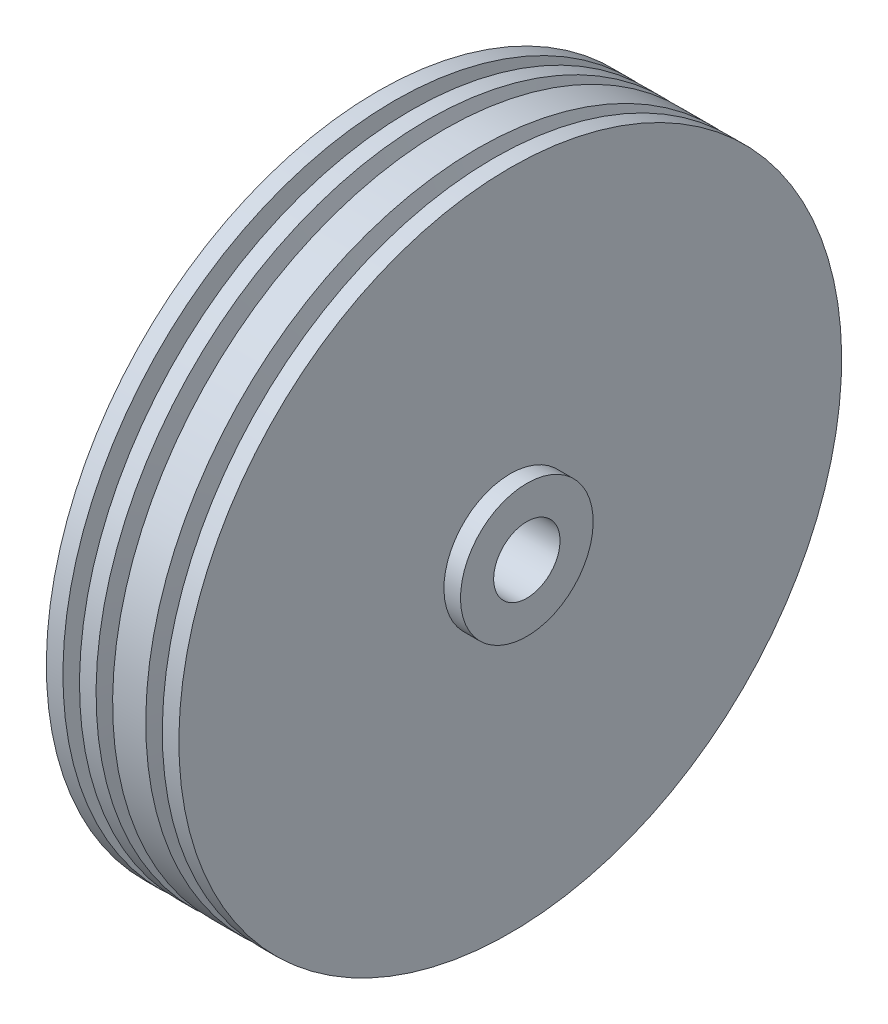
ISO-10303-21;
HEADER;
FILE_DESCRIPTION(('STEP AP214'),'2;1');
FILE_NAME('part.step','',(''),(''),'','','');
FILE_SCHEMA(('AUTOMOTIVE_DESIGN { 1 0 10303 214 1 1 1 1 }'));
ENDSEC;
DATA;
#1=APPLICATION_CONTEXT('core data for automotive mechanical design processes');
#2=APPLICATION_PROTOCOL_DEFINITION('international standard','automotive_design',2000,#1);
#3=PRODUCT_CONTEXT('',#1,'mechanical');
#4=PRODUCT('Part','Part','',(#3));
#5=PRODUCT_RELATED_PRODUCT_CATEGORY('part','',(#4));
#6=PRODUCT_DEFINITION_FORMATION('','',#4);
#7=PRODUCT_DEFINITION_CONTEXT('part definition',#1,'design');
#8=PRODUCT_DEFINITION('design','',#6,#7);
#9=PRODUCT_DEFINITION_SHAPE('','',#8);
#10=(LENGTH_UNIT() NAMED_UNIT(*) SI_UNIT(.MILLI.,.METRE.));
#11=(NAMED_UNIT(*) PLANE_ANGLE_UNIT() SI_UNIT($,.RADIAN.));
#12=(NAMED_UNIT(*) SI_UNIT($,.STERADIAN.) SOLID_ANGLE_UNIT());
#13=UNCERTAINTY_MEASURE_WITH_UNIT(LENGTH_MEASURE(1.E-05),#10,'distance_accuracy_value','');
#14=(GEOMETRIC_REPRESENTATION_CONTEXT(3) GLOBAL_UNCERTAINTY_ASSIGNED_CONTEXT((#13)) GLOBAL_UNIT_ASSIGNED_CONTEXT((#10,
#11,#12)) REPRESENTATION_CONTEXT('',''));
#15=CARTESIAN_POINT('',(0.,0.,0.));
#16=DIRECTION('',(0.,0.,1.));
#17=DIRECTION('',(1.,0.,0.));
#18=AXIS2_PLACEMENT_3D('',#15,#16,#17);
#19=CARTESIAN_POINT('',(-15.224198292623,10.0164129397258,0.));
#20=DIRECTION('',(1.,0.,0.));
#21=DIRECTION('',(0.,1.,0.));
#22=AXIS2_PLACEMENT_3D('',#19,#20,#21);
#23=PLANE('',#22);
#24=CARTESIAN_POINT('',(-15.224198292623,0.,0.));
#25=DIRECTION('',(1.,0.,0.));
#26=DIRECTION('',(0.,1.,0.));
#27=AXIS2_PLACEMENT_3D('',#24,#25,#26);
#28=CIRCLE('',#27,20.0164129397258);
#29=CARTESIAN_POINT('',(-15.224198292623,20.0164129397258,0.));
#30=VERTEX_POINT('',#29);
#31=EDGE_CURVE('E10',#30,#30,#28,.T.);
#32=ORIENTED_EDGE('',*,*,#31,.T.);
#33=EDGE_LOOP('',(#32));
#34=FACE_BOUND('',#33,.T.);
#35=CARTESIAN_POINT('',(-15.224198292623,0.,0.));
#36=DIRECTION('',(1.,0.,0.));
#37=DIRECTION('',(0.,1.,0.));
#38=AXIS2_PLACEMENT_3D('',#35,#36,#37);
#39=CIRCLE('',#38,10.0164129397258);
#40=CARTESIAN_POINT('',(-15.224198292623,10.0164129397258,0.));
#41=VERTEX_POINT('',#40);
#42=EDGE_CURVE('E96',#41,#41,#39,.T.);
#43=ORIENTED_EDGE('',*,*,#42,.F.);
#44=EDGE_LOOP('',(#43));
#45=FACE_BOUND('',#44,.T.);
#46=ADVANCED_FACE('F32',(#34,#45),#23,.T.);
#47=CARTESIAN_POINT('',(68.9055825623334,0.,0.));
#48=DIRECTION('',(1.,0.,0.));
#49=DIRECTION('',(0.,1.,0.));
#50=AXIS2_PLACEMENT_3D('',#47,#48,#49);
#51=CYLINDRICAL_SURFACE('',#50,20.0164129397258);
#52=CARTESIAN_POINT('',(-20.224198292623,0.,0.));
#53=DIRECTION('',(1.,0.,0.));
#54=DIRECTION('',(0.,1.,0.));
#55=AXIS2_PLACEMENT_3D('',#52,#53,#54);
#56=CIRCLE('',#55,20.0164129397258);
#57=CARTESIAN_POINT('',(-20.224198292623,20.0164129397258,0.));
#58=VERTEX_POINT('',#57);
#59=EDGE_CURVE('E38',#58,#58,#56,.T.);
#60=ORIENTED_EDGE('',*,*,#59,.T.);
#61=EDGE_LOOP('',(#60));
#62=FACE_BOUND('',#61,.T.);
#63=ORIENTED_EDGE('',*,*,#31,.F.);
#64=EDGE_LOOP('',(#63));
#65=FACE_BOUND('',#64,.T.);
#66=ADVANCED_FACE('F104',(#62,#65),#51,.T.);
#67=CARTESIAN_POINT('',(-20.224198292623,80.0164129397258,0.));
#68=DIRECTION('',(1.,0.,0.));
#69=DIRECTION('',(0.,1.,0.));
#70=AXIS2_PLACEMENT_3D('',#67,#68,#69);
#71=PLANE('',#70);
#72=CARTESIAN_POINT('',(-20.224198292623,0.,0.));
#73=DIRECTION('',(1.,0.,0.));
#74=DIRECTION('',(0.,1.,0.));
#75=AXIS2_PLACEMENT_3D('',#72,#73,#74);
#76=CIRCLE('',#75,100.016412939726);
#77=CARTESIAN_POINT('',(-20.224198292623,100.016412939726,0.));
#78=VERTEX_POINT('',#77);
#79=EDGE_CURVE('E42',#78,#78,#76,.T.);
#80=ORIENTED_EDGE('',*,*,#79,.T.);
#81=EDGE_LOOP('',(#80));
#82=FACE_BOUND('',#81,.T.);
#83=ORIENTED_EDGE('',*,*,#59,.F.);
#84=EDGE_LOOP('',(#83));
#85=FACE_BOUND('',#84,.T.);
#86=ADVANCED_FACE('F108',(#82,#85),#71,.T.);
#87=CARTESIAN_POINT('',(68.9055825623334,0.,0.));
#88=DIRECTION('',(1.,0.,0.));
#89=DIRECTION('',(0.,1.,0.));
#90=AXIS2_PLACEMENT_3D('',#87,#88,#89);
#91=CYLINDRICAL_SURFACE('',#90,100.016412939726);
#92=CARTESIAN_POINT('',(-25.224198292623,0.,0.));
#93=DIRECTION('',(1.,0.,0.));
#94=DIRECTION('',(0.,1.,0.));
#95=AXIS2_PLACEMENT_3D('',#92,#93,#94);
#96=CIRCLE('',#95,100.016412939726);
#97=CARTESIAN_POINT('',(-25.224198292623,100.016412939726,0.));
#98=VERTEX_POINT('',#97);
#99=EDGE_CURVE('E46',#98,#98,#96,.T.);
#100=ORIENTED_EDGE('',*,*,#99,.T.);
#101=EDGE_LOOP('',(#100));
#102=FACE_BOUND('',#101,.T.);
#103=ORIENTED_EDGE('',*,*,#79,.F.);
#104=EDGE_LOOP('',(#103));
#105=FACE_BOUND('',#104,.T.);
#106=ADVANCED_FACE('F112',(#102,#105),#91,.T.);
#107=CARTESIAN_POINT('',(-25.224198292623,0.,0.));
#108=DIRECTION('',(1.,0.,0.));
#109=DIRECTION('',(0.,1.,0.));
#110=AXIS2_PLACEMENT_3D('',#107,#108,#109);
#111=CONICAL_SURFACE('',#110,100.016412939726,1.32581766366803);
#112=CARTESIAN_POINT('',(-27.724198292623,0.,0.));
#113=DIRECTION('',(1.,0.,0.));
#114=DIRECTION('',(0.,1.,0.));
#115=AXIS2_PLACEMENT_3D('',#112,#113,#114);
#116=CIRCLE('',#115,90.0164129397258);
#117=CARTESIAN_POINT('',(-27.724198292623,90.0164129397258,0.));
#118=VERTEX_POINT('',#117);
#119=EDGE_CURVE('E51',#118,#118,#116,.T.);
#120=ORIENTED_EDGE('',*,*,#119,.T.);
#121=EDGE_LOOP('',(#120));
#122=FACE_BOUND('',#121,.T.);
#123=ORIENTED_EDGE('',*,*,#99,.F.);
#124=EDGE_LOOP('',(#123));
#125=FACE_BOUND('',#124,.T.);
#126=ADVANCED_FACE('F119',(#122,#125),#111,.T.);
#127=CARTESIAN_POINT('',(-27.724198292623,0.,0.));
#128=DIRECTION('',(-1.,0.,0.));
#129=DIRECTION('',(0.,-1.,0.));
#130=AXIS2_PLACEMENT_3D('',#127,#128,#129);
#131=CONICAL_SURFACE('',#130,90.0164129397258,1.32581766366803);
#132=CARTESIAN_POINT('',(-30.2241982926231,0.,0.));
#133=DIRECTION('',(1.,0.,0.));
#134=DIRECTION('',(0.,1.,0.));
#135=AXIS2_PLACEMENT_3D('',#132,#133,#134);
#136=CIRCLE('',#135,100.016412939726);
#137=CARTESIAN_POINT('',(-30.2241982926231,100.016412939726,0.));
#138=VERTEX_POINT('',#137);
#139=EDGE_CURVE('E54',#138,#138,#136,.T.);
#140=ORIENTED_EDGE('',*,*,#139,.T.);
#141=EDGE_LOOP('',(#140));
#142=FACE_BOUND('',#141,.T.);
#143=ORIENTED_EDGE('',*,*,#119,.F.);
#144=EDGE_LOOP('',(#143));
#145=FACE_BOUND('',#144,.T.);
#146=ADVANCED_FACE('F123',(#142,#145),#131,.T.);
#147=CARTESIAN_POINT('',(68.9055825623334,0.,0.));
#148=DIRECTION('',(1.,0.,0.));
#149=DIRECTION('',(0.,1.,0.));
#150=AXIS2_PLACEMENT_3D('',#147,#148,#149);
#151=CYLINDRICAL_SURFACE('',#150,100.016412939726);
#152=CARTESIAN_POINT('',(-40.2241982926229,0.,0.));
#153=DIRECTION('',(1.,0.,0.));
#154=DIRECTION('',(0.,1.,0.));
#155=AXIS2_PLACEMENT_3D('',#152,#153,#154);
#156=CIRCLE('',#155,100.016412939726);
#157=CARTESIAN_POINT('',(-40.2241982926229,100.016412939726,0.));
#158=VERTEX_POINT('',#157);
#159=EDGE_CURVE('E57',#158,#158,#156,.T.);
#160=ORIENTED_EDGE('',*,*,#159,.T.);
#161=EDGE_LOOP('',(#160));
#162=FACE_BOUND('',#161,.T.);
#163=ORIENTED_EDGE('',*,*,#139,.F.);
#164=EDGE_LOOP('',(#163));
#165=FACE_BOUND('',#164,.T.);
#166=ADVANCED_FACE('F127',(#162,#165),#151,.T.);
#167=CARTESIAN_POINT('',(-40.2241982926229,0.,0.));
#168=DIRECTION('',(1.,0.,0.));
#169=DIRECTION('',(0.,1.,0.));
#170=AXIS2_PLACEMENT_3D('',#167,#168,#169);
#171=CONICAL_SURFACE('',#170,100.016412939726,1.32581766366803);
#172=CARTESIAN_POINT('',(-42.724198292623,0.,0.));
#173=DIRECTION('',(1.,0.,0.));
#174=DIRECTION('',(0.,1.,0.));
#175=AXIS2_PLACEMENT_3D('',#172,#173,#174);
#176=CIRCLE('',#175,90.0164129397258);
#177=CARTESIAN_POINT('',(-42.724198292623,90.0164129397258,0.));
#178=VERTEX_POINT('',#177);
#179=EDGE_CURVE('E60',#178,#178,#176,.T.);
#180=ORIENTED_EDGE('',*,*,#179,.T.);
#181=EDGE_LOOP('',(#180));
#182=FACE_BOUND('',#181,.T.);
#183=ORIENTED_EDGE('',*,*,#159,.F.);
#184=EDGE_LOOP('',(#183));
#185=FACE_BOUND('',#184,.T.);
#186=ADVANCED_FACE('F131',(#182,#185),#171,.T.);
#187=CARTESIAN_POINT('',(-42.724198292623,0.,0.));
#188=DIRECTION('',(-1.,0.,0.));
#189=DIRECTION('',(0.,-1.,0.));
#190=AXIS2_PLACEMENT_3D('',#187,#188,#189);
#191=CONICAL_SURFACE('',#190,90.0164129397258,1.32581766366803);
#192=CARTESIAN_POINT('',(-45.2241982926231,0.,0.));
#193=DIRECTION('',(1.,0.,0.));
#194=DIRECTION('',(0.,1.,0.));
#195=AXIS2_PLACEMENT_3D('',#192,#193,#194);
#196=CIRCLE('',#195,100.016412939726);
#197=CARTESIAN_POINT('',(-45.2241982926231,100.016412939726,0.));
#198=VERTEX_POINT('',#197);
#199=EDGE_CURVE('E63',#198,#198,#196,.T.);
#200=ORIENTED_EDGE('',*,*,#199,.T.);
#201=EDGE_LOOP('',(#200));
#202=FACE_BOUND('',#201,.T.);
#203=ORIENTED_EDGE('',*,*,#179,.F.);
#204=EDGE_LOOP('',(#203));
#205=FACE_BOUND('',#204,.T.);
#206=ADVANCED_FACE('F135',(#202,#205),#191,.T.);
#207=CARTESIAN_POINT('',(68.9055825623334,0.,0.));
#208=DIRECTION('',(1.,0.,0.));
#209=DIRECTION('',(0.,1.,0.));
#210=AXIS2_PLACEMENT_3D('',#207,#208,#209);
#211=CYLINDRICAL_SURFACE('',#210,100.016412939726);
#212=CARTESIAN_POINT('',(-50.224198292623,0.,0.));
#213=DIRECTION('',(1.,0.,0.));
#214=DIRECTION('',(0.,1.,0.));
#215=AXIS2_PLACEMENT_3D('',#212,#213,#214);
#216=CIRCLE('',#215,100.016412939726);
#217=CARTESIAN_POINT('',(-50.224198292623,100.016412939726,0.));
#218=VERTEX_POINT('',#217);
#219=EDGE_CURVE('E66',#218,#218,#216,.T.);
#220=ORIENTED_EDGE('',*,*,#219,.T.);
#221=EDGE_LOOP('',(#220));
#222=FACE_BOUND('',#221,.T.);
#223=ORIENTED_EDGE('',*,*,#199,.F.);
#224=EDGE_LOOP('',(#223));
#225=FACE_BOUND('',#224,.T.);
#226=ADVANCED_FACE('F139',(#222,#225),#211,.T.);
#227=CARTESIAN_POINT('',(-50.224198292623,90.0164129397258,0.));
#228=DIRECTION('',(-1.,0.,0.));
#229=DIRECTION('',(0.,-1.,0.));
#230=AXIS2_PLACEMENT_3D('',#227,#228,#229);
#231=PLANE('',#230);
#232=CARTESIAN_POINT('',(-50.224198292623,0.,0.));
#233=DIRECTION('',(1.,0.,0.));
#234=DIRECTION('',(0.,1.,0.));
#235=AXIS2_PLACEMENT_3D('',#232,#233,#234);
#236=CIRCLE('',#235,90.0164129397258);
#237=CARTESIAN_POINT('',(-50.224198292623,90.0164129397258,0.));
#238=VERTEX_POINT('',#237);
#239=EDGE_CURVE('E69',#238,#238,#236,.T.);
#240=ORIENTED_EDGE('',*,*,#239,.T.);
#241=EDGE_LOOP('',(#240));
#242=FACE_BOUND('',#241,.T.);
#243=ORIENTED_EDGE('',*,*,#219,.F.);
#244=EDGE_LOOP('',(#243));
#245=FACE_BOUND('',#244,.T.);
#246=ADVANCED_FACE('F143',(#242,#245),#231,.T.);
#247=CARTESIAN_POINT('',(68.9055825623334,0.,0.));
#248=DIRECTION('',(1.,0.,0.));
#249=DIRECTION('',(0.,1.,0.));
#250=AXIS2_PLACEMENT_3D('',#247,#248,#249);
#251=CYLINDRICAL_SURFACE('',#250,90.0164129397258);
#252=CARTESIAN_POINT('',(-55.224198292623,0.,0.));
#253=DIRECTION('',(1.,0.,0.));
#254=DIRECTION('',(0.,1.,0.));
#255=AXIS2_PLACEMENT_3D('',#252,#253,#254);
#256=CIRCLE('',#255,90.0164129397258);
#257=CARTESIAN_POINT('',(-55.224198292623,90.0164129397258,0.));
#258=VERTEX_POINT('',#257);
#259=EDGE_CURVE('E72',#258,#258,#256,.T.);
#260=ORIENTED_EDGE('',*,*,#259,.T.);
#261=EDGE_LOOP('',(#260));
#262=FACE_BOUND('',#261,.T.);
#263=ORIENTED_EDGE('',*,*,#239,.F.);
#264=EDGE_LOOP('',(#263));
#265=FACE_BOUND('',#264,.T.);
#266=ADVANCED_FACE('F147',(#262,#265),#251,.T.);
#267=CARTESIAN_POINT('',(-55.224198292623,100.016412939726,0.));
#268=DIRECTION('',(1.,0.,0.));
#269=DIRECTION('',(0.,1.,0.));
#270=AXIS2_PLACEMENT_3D('',#267,#268,#269);
#271=PLANE('',#270);
#272=CARTESIAN_POINT('',(-55.224198292623,0.,0.));
#273=DIRECTION('',(1.,0.,0.));
#274=DIRECTION('',(0.,1.,0.));
#275=AXIS2_PLACEMENT_3D('',#272,#273,#274);
#276=CIRCLE('',#275,100.016412939726);
#277=CARTESIAN_POINT('',(-55.224198292623,100.016412939726,0.));
#278=VERTEX_POINT('',#277);
#279=EDGE_CURVE('E75',#278,#278,#276,.T.);
#280=ORIENTED_EDGE('',*,*,#279,.T.);
#281=EDGE_LOOP('',(#280));
#282=FACE_BOUND('',#281,.T.);
#283=ORIENTED_EDGE('',*,*,#259,.F.);
#284=EDGE_LOOP('',(#283));
#285=FACE_BOUND('',#284,.T.);
#286=ADVANCED_FACE('F151',(#282,#285),#271,.T.);
#287=CARTESIAN_POINT('',(68.9055825623334,0.,0.));
#288=DIRECTION('',(1.,0.,0.));
#289=DIRECTION('',(0.,1.,0.));
#290=AXIS2_PLACEMENT_3D('',#287,#288,#289);
#291=CYLINDRICAL_SURFACE('',#290,100.016412939726);
#292=CARTESIAN_POINT('',(-60.224198292623,0.,0.));
#293=DIRECTION('',(1.,0.,0.));
#294=DIRECTION('',(0.,1.,0.));
#295=AXIS2_PLACEMENT_3D('',#292,#293,#294);
#296=CIRCLE('',#295,100.016412939726);
#297=CARTESIAN_POINT('',(-60.224198292623,100.016412939726,0.));
#298=VERTEX_POINT('',#297);
#299=EDGE_CURVE('E78',#298,#298,#296,.T.);
#300=ORIENTED_EDGE('',*,*,#299,.T.);
#301=EDGE_LOOP('',(#300));
#302=FACE_BOUND('',#301,.T.);
#303=ORIENTED_EDGE('',*,*,#279,.F.);
#304=EDGE_LOOP('',(#303));
#305=FACE_BOUND('',#304,.T.);
#306=ADVANCED_FACE('F155',(#302,#305),#291,.T.);
#307=CARTESIAN_POINT('',(-60.224198292623,80.016412939728,0.));
#308=DIRECTION('',(-1.,0.,0.));
#309=DIRECTION('',(0.,-1.,0.));
#310=AXIS2_PLACEMENT_3D('',#307,#308,#309);
#311=PLANE('',#310);
#312=CARTESIAN_POINT('',(-60.224198292623,0.,0.));
#313=DIRECTION('',(1.,0.,0.));
#314=DIRECTION('',(0.,1.,0.));
#315=AXIS2_PLACEMENT_3D('',#312,#313,#314);
#316=CIRCLE('',#315,80.016412939728);
#317=CARTESIAN_POINT('',(-60.224198292623,80.016412939728,0.));
#318=VERTEX_POINT('',#317);
#319=EDGE_CURVE('E81',#318,#318,#316,.T.);
#320=ORIENTED_EDGE('',*,*,#319,.T.);
#321=EDGE_LOOP('',(#320));
#322=FACE_BOUND('',#321,.T.);
#323=ORIENTED_EDGE('',*,*,#299,.F.);
#324=EDGE_LOOP('',(#323));
#325=FACE_BOUND('',#324,.T.);
#326=ADVANCED_FACE('F159',(#322,#325),#311,.T.);
#327=CARTESIAN_POINT('',(68.9055825623334,0.,0.));
#328=DIRECTION('',(1.,0.,0.));
#329=DIRECTION('',(0.,1.,0.));
#330=AXIS2_PLACEMENT_3D('',#327,#328,#329);
#331=CYLINDRICAL_SURFACE('',#330,80.016412939728);
#332=CARTESIAN_POINT('',(-30.224198292623,0.,0.));
#333=DIRECTION('',(1.,0.,0.));
#334=DIRECTION('',(0.,1.,0.));
#335=AXIS2_PLACEMENT_3D('',#332,#333,#334);
#336=CIRCLE('',#335,80.016412939728);
#337=CARTESIAN_POINT('',(-30.224198292623,80.016412939728,0.));
#338=VERTEX_POINT('',#337);
#339=EDGE_CURVE('E84',#338,#338,#336,.T.);
#340=ORIENTED_EDGE('',*,*,#339,.T.);
#341=EDGE_LOOP('',(#340));
#342=FACE_BOUND('',#341,.T.);
#343=ORIENTED_EDGE('',*,*,#319,.F.);
#344=EDGE_LOOP('',(#343));
#345=FACE_BOUND('',#344,.T.);
#346=ADVANCED_FACE('F163',(#342,#345),#331,.F.);
#347=CARTESIAN_POINT('',(-30.224198292623,20.0164129397258,0.));
#348=DIRECTION('',(-1.,0.,0.));
#349=DIRECTION('',(0.,-1.,0.));
#350=AXIS2_PLACEMENT_3D('',#347,#348,#349);
#351=PLANE('',#350);
#352=CARTESIAN_POINT('',(-30.224198292623,0.,0.));
#353=DIRECTION('',(1.,0.,0.));
#354=DIRECTION('',(0.,1.,0.));
#355=AXIS2_PLACEMENT_3D('',#352,#353,#354);
#356=CIRCLE('',#355,20.0164129397258);
#357=CARTESIAN_POINT('',(-30.224198292623,20.0164129397258,0.));
#358=VERTEX_POINT('',#357);
#359=EDGE_CURVE('E87',#358,#358,#356,.T.);
#360=ORIENTED_EDGE('',*,*,#359,.T.);
#361=EDGE_LOOP('',(#360));
#362=FACE_BOUND('',#361,.T.);
#363=ORIENTED_EDGE('',*,*,#339,.F.);
#364=EDGE_LOOP('',(#363));
#365=FACE_BOUND('',#364,.T.);
#366=ADVANCED_FACE('F167',(#362,#365),#351,.T.);
#367=CARTESIAN_POINT('',(68.9055825623334,0.,0.));
#368=DIRECTION('',(1.,0.,0.));
#369=DIRECTION('',(0.,1.,0.));
#370=AXIS2_PLACEMENT_3D('',#367,#368,#369);
#371=CYLINDRICAL_SURFACE('',#370,20.0164129397258);
#372=CARTESIAN_POINT('',(-35.224198292623,0.,0.));
#373=DIRECTION('',(1.,0.,0.));
#374=DIRECTION('',(0.,1.,0.));
#375=AXIS2_PLACEMENT_3D('',#372,#373,#374);
#376=CIRCLE('',#375,20.0164129397258);
#377=CARTESIAN_POINT('',(-35.224198292623,20.0164129397258,0.));
#378=VERTEX_POINT('',#377);
#379=EDGE_CURVE('E90',#378,#378,#376,.T.);
#380=ORIENTED_EDGE('',*,*,#379,.T.);
#381=EDGE_LOOP('',(#380));
#382=FACE_BOUND('',#381,.T.);
#383=ORIENTED_EDGE('',*,*,#359,.F.);
#384=EDGE_LOOP('',(#383));
#385=FACE_BOUND('',#384,.T.);
#386=ADVANCED_FACE('F171',(#382,#385),#371,.T.);
#387=CARTESIAN_POINT('',(-35.224198292623,10.0164129397258,0.));
#388=DIRECTION('',(-1.,0.,0.));
#389=DIRECTION('',(0.,-1.,0.));
#390=AXIS2_PLACEMENT_3D('',#387,#388,#389);
#391=PLANE('',#390);
#392=CARTESIAN_POINT('',(-35.224198292623,0.,0.));
#393=DIRECTION('',(1.,0.,0.));
#394=DIRECTION('',(0.,1.,0.));
#395=AXIS2_PLACEMENT_3D('',#392,#393,#394);
#396=CIRCLE('',#395,10.0164129397258);
#397=CARTESIAN_POINT('',(-35.224198292623,10.0164129397258,0.));
#398=VERTEX_POINT('',#397);
#399=EDGE_CURVE('E93',#398,#398,#396,.T.);
#400=ORIENTED_EDGE('',*,*,#399,.T.);
#401=EDGE_LOOP('',(#400));
#402=FACE_BOUND('',#401,.T.);
#403=ORIENTED_EDGE('',*,*,#379,.F.);
#404=EDGE_LOOP('',(#403));
#405=FACE_BOUND('',#404,.T.);
#406=ADVANCED_FACE('F175',(#402,#405),#391,.T.);
#407=CARTESIAN_POINT('',(68.9055825623334,0.,0.));
#408=DIRECTION('',(1.,0.,0.));
#409=DIRECTION('',(0.,1.,0.));
#410=AXIS2_PLACEMENT_3D('',#407,#408,#409);
#411=CYLINDRICAL_SURFACE('',#410,10.0164129397258);
#412=ORIENTED_EDGE('',*,*,#42,.T.);
#413=EDGE_LOOP('',(#412));
#414=FACE_BOUND('',#413,.T.);
#415=ORIENTED_EDGE('',*,*,#399,.F.);
#416=EDGE_LOOP('',(#415));
#417=FACE_BOUND('',#416,.T.);
#418=ADVANCED_FACE('F100',(#414,#417),#411,.F.);
#419=CLOSED_SHELL('',(#46,#66,#86,#106,#126,#146,#166,#186,#206,#226,#246,#266,#286,#306,#326,
#346,#366,#386,#406,#418));
#420=MANIFOLD_SOLID_BREP('B2',#419);
#421=ADVANCED_BREP_SHAPE_REPRESENTATION('',(#18,#420),#14);
#422=SHAPE_DEFINITION_REPRESENTATION(#9,#421);
ENDSEC;
END-ISO-10303-21;
